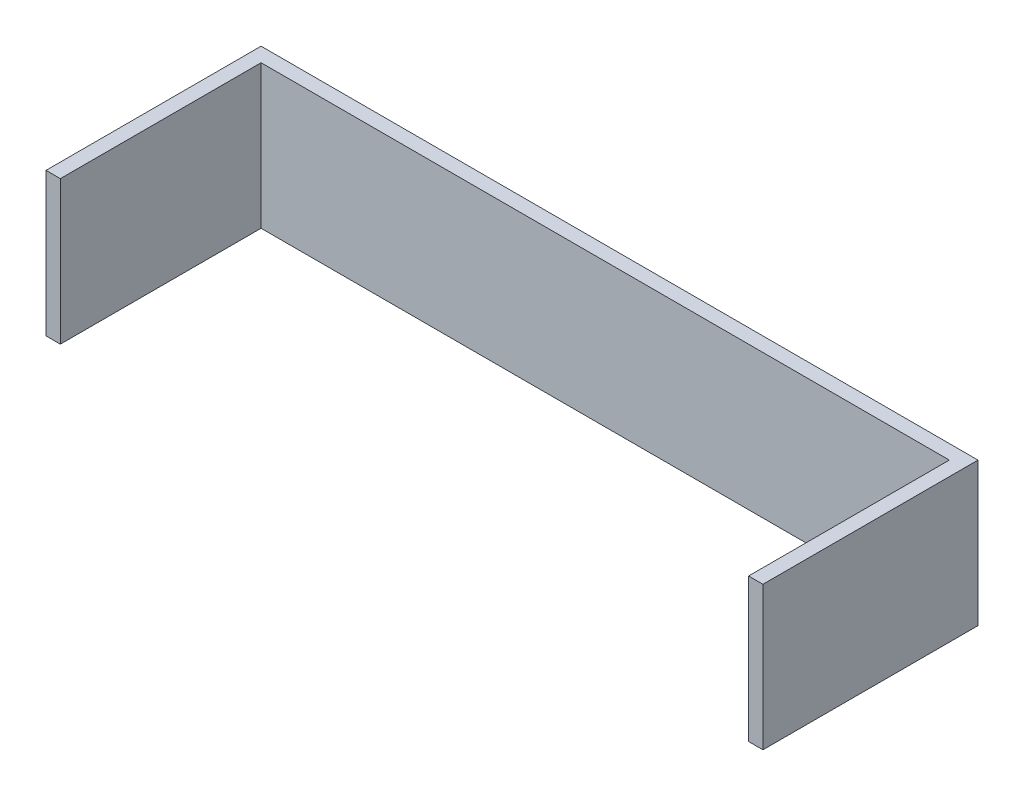
ISO-10303-21;
HEADER;
FILE_DESCRIPTION(('STEP AP214'),'2;1');
FILE_NAME('part.step','',(''),(''),'','','');
FILE_SCHEMA(('AUTOMOTIVE_DESIGN { 1 0 10303 214 1 1 1 1 }'));
ENDSEC;
DATA;
#1=APPLICATION_CONTEXT('core data for automotive mechanical design processes');
#2=APPLICATION_PROTOCOL_DEFINITION('international standard','automotive_design',2000,#1);
#3=PRODUCT_CONTEXT('',#1,'mechanical');
#4=PRODUCT('Part','Part','',(#3));
#5=PRODUCT_RELATED_PRODUCT_CATEGORY('part','',(#4));
#6=PRODUCT_DEFINITION_FORMATION('','',#4);
#7=PRODUCT_DEFINITION_CONTEXT('part definition',#1,'design');
#8=PRODUCT_DEFINITION('design','',#6,#7);
#9=PRODUCT_DEFINITION_SHAPE('','',#8);
#10=(LENGTH_UNIT() NAMED_UNIT(*) SI_UNIT(.MILLI.,.METRE.));
#11=(NAMED_UNIT(*) PLANE_ANGLE_UNIT() SI_UNIT($,.RADIAN.));
#12=(NAMED_UNIT(*) SI_UNIT($,.STERADIAN.) SOLID_ANGLE_UNIT());
#13=UNCERTAINTY_MEASURE_WITH_UNIT(LENGTH_MEASURE(1.E-05),#10,'distance_accuracy_value','');
#14=(GEOMETRIC_REPRESENTATION_CONTEXT(3) GLOBAL_UNCERTAINTY_ASSIGNED_CONTEXT((#13)) GLOBAL_UNIT_ASSIGNED_CONTEXT((#10,
#11,#12)) REPRESENTATION_CONTEXT('',''));
#15=CARTESIAN_POINT('',(0.,0.,0.));
#16=DIRECTION('',(0.,0.,1.));
#17=DIRECTION('',(1.,0.,0.));
#18=AXIS2_PLACEMENT_3D('',#15,#16,#17);
#19=CARTESIAN_POINT('',(24.,-5.,7.5));
#20=DIRECTION('',(0.,0.,1.));
#21=DIRECTION('',(1.,0.,0.));
#22=AXIS2_PLACEMENT_3D('',#19,#20,#21);
#23=PLANE('',#22);
#24=DIRECTION('',(1.,0.,0.));
#25=VECTOR('',#24,1.);
#26=CARTESIAN_POINT('',(24.,-5.,7.5));
#27=LINE('',#26,#25);
#28=CARTESIAN_POINT('',(24.,-5.,7.5));
#29=VERTEX_POINT('',#28);
#30=CARTESIAN_POINT('',(25.,-5.,7.5));
#31=VERTEX_POINT('',#30);
#32=EDGE_CURVE('E20',#29,#31,#27,.T.);
#33=ORIENTED_EDGE('',*,*,#32,.T.);
#34=DIRECTION('',(0.,1.,0.));
#35=VECTOR('',#34,1.);
#36=CARTESIAN_POINT('',(25.,-5.,7.5));
#37=LINE('',#36,#35);
#38=CARTESIAN_POINT('',(25.,5.,7.5));
#39=VERTEX_POINT('',#38);
#40=EDGE_CURVE('E118',#39,#31,#37,.F.);
#41=ORIENTED_EDGE('',*,*,#40,.F.);
#42=DIRECTION('',(1.,0.,0.));
#43=VECTOR('',#42,1.);
#44=CARTESIAN_POINT('',(0.,5.,7.5));
#45=LINE('',#44,#43);
#46=CARTESIAN_POINT('',(24.,5.,7.5));
#47=VERTEX_POINT('',#46);
#48=EDGE_CURVE('E144',#47,#39,#45,.T.);
#49=ORIENTED_EDGE('',*,*,#48,.F.);
#50=DIRECTION('',(0.,1.,0.));
#51=VECTOR('',#50,1.);
#52=CARTESIAN_POINT('',(24.,-5.,7.5));
#53=LINE('',#52,#51);
#54=EDGE_CURVE('E92',#29,#47,#53,.T.);
#55=ORIENTED_EDGE('',*,*,#54,.F.);
#56=EDGE_LOOP('',(#33,#41,#49,#55));
#57=FACE_BOUND('',#56,.T.);
#58=ADVANCED_FACE('F17',(#57),#23,.T.);
#59=CARTESIAN_POINT('',(-24.,-5.,7.5));
#60=DIRECTION('',(1.,0.,0.));
#61=DIRECTION('',(0.,0.,-1.));
#62=AXIS2_PLACEMENT_3D('',#59,#60,#61);
#63=PLANE('',#62);
#64=DIRECTION('',(0.,0.,1.));
#65=VECTOR('',#64,1.);
#66=CARTESIAN_POINT('',(-24.,-5.,0.));
#67=LINE('',#66,#65);
#68=CARTESIAN_POINT('',(-24.,-5.,7.5));
#69=VERTEX_POINT('',#68);
#70=CARTESIAN_POINT('',(-24.,-5.,-6.5));
#71=VERTEX_POINT('',#70);
#72=EDGE_CURVE('E140',#69,#71,#67,.F.);
#73=ORIENTED_EDGE('',*,*,#72,.T.);
#74=DIRECTION('',(0.,1.,0.));
#75=VECTOR('',#74,1.);
#76=CARTESIAN_POINT('',(-24.,-5.,-6.5));
#77=LINE('',#76,#75);
#78=CARTESIAN_POINT('',(-24.,5.,-6.5));
#79=VERTEX_POINT('',#78);
#80=EDGE_CURVE('E79',#79,#71,#77,.F.);
#81=ORIENTED_EDGE('',*,*,#80,.F.);
#82=DIRECTION('',(0.,0.,1.));
#83=VECTOR('',#82,1.);
#84=CARTESIAN_POINT('',(-24.,5.,0.));
#85=LINE('',#84,#83);
#86=CARTESIAN_POINT('',(-24.,5.,7.5));
#87=VERTEX_POINT('',#86);
#88=EDGE_CURVE('E95',#87,#79,#85,.F.);
#89=ORIENTED_EDGE('',*,*,#88,.F.);
#90=DIRECTION('',(0.,1.,0.));
#91=VECTOR('',#90,1.);
#92=CARTESIAN_POINT('',(-24.,-5.,7.5));
#93=LINE('',#92,#91);
#94=EDGE_CURVE('E84',#69,#87,#93,.T.);
#95=ORIENTED_EDGE('',*,*,#94,.F.);
#96=EDGE_LOOP('',(#73,#81,#89,#95));
#97=FACE_BOUND('',#96,.T.);
#98=ADVANCED_FACE('F96',(#97),#63,.T.);
#99=CARTESIAN_POINT('',(-24.,-5.,-6.5));
#100=DIRECTION('',(0.,0.,1.));
#101=DIRECTION('',(1.,0.,0.));
#102=AXIS2_PLACEMENT_3D('',#99,#100,#101);
#103=PLANE('',#102);
#104=DIRECTION('',(1.,0.,0.));
#105=VECTOR('',#104,1.);
#106=CARTESIAN_POINT('',(0.,-5.,-6.5));
#107=LINE('',#106,#105);
#108=CARTESIAN_POINT('',(24.,-5.,-6.5));
#109=VERTEX_POINT('',#108);
#110=EDGE_CURVE('E135',#71,#109,#107,.T.);
#111=ORIENTED_EDGE('',*,*,#110,.T.);
#112=DIRECTION('',(0.,1.,0.));
#113=VECTOR('',#112,1.);
#114=CARTESIAN_POINT('',(24.,-5.,-6.49999999999999));
#115=LINE('',#114,#113);
#116=CARTESIAN_POINT('',(24.,5.,-6.5));
#117=VERTEX_POINT('',#116);
#118=EDGE_CURVE('E109',#117,#109,#115,.F.);
#119=ORIENTED_EDGE('',*,*,#118,.F.);
#120=DIRECTION('',(1.,0.,0.));
#121=VECTOR('',#120,1.);
#122=CARTESIAN_POINT('',(0.,5.,-6.5));
#123=LINE('',#122,#121);
#124=EDGE_CURVE('E99',#79,#117,#123,.T.);
#125=ORIENTED_EDGE('',*,*,#124,.F.);
#126=ORIENTED_EDGE('',*,*,#80,.T.);
#127=EDGE_LOOP('',(#111,#119,#125,#126));
#128=FACE_BOUND('',#127,.T.);
#129=ADVANCED_FACE('F149',(#128),#103,.T.);
#130=CARTESIAN_POINT('',(24.,-5.,-6.49999999999999));
#131=DIRECTION('',(-1.,0.,0.));
#132=DIRECTION('',(0.,0.,1.));
#133=AXIS2_PLACEMENT_3D('',#130,#131,#132);
#134=PLANE('',#133);
#135=DIRECTION('',(0.,0.,1.));
#136=VECTOR('',#135,1.);
#137=CARTESIAN_POINT('',(24.,-5.,0.));
#138=LINE('',#137,#136);
#139=EDGE_CURVE('E132',#109,#29,#138,.T.);
#140=ORIENTED_EDGE('',*,*,#139,.T.);
#141=ORIENTED_EDGE('',*,*,#54,.T.);
#142=DIRECTION('',(0.,0.,1.));
#143=VECTOR('',#142,1.);
#144=CARTESIAN_POINT('',(24.,5.,0.));
#145=LINE('',#144,#143);
#146=EDGE_CURVE('E146',#117,#47,#145,.T.);
#147=ORIENTED_EDGE('',*,*,#146,.F.);
#148=ORIENTED_EDGE('',*,*,#118,.T.);
#149=EDGE_LOOP('',(#140,#141,#147,#148));
#150=FACE_BOUND('',#149,.T.);
#151=ADVANCED_FACE('F151',(#150),#134,.T.);
#152=CARTESIAN_POINT('',(-25.,-5.,7.5));
#153=DIRECTION('',(0.,0.,1.));
#154=DIRECTION('',(1.,0.,0.));
#155=AXIS2_PLACEMENT_3D('',#152,#153,#154);
#156=PLANE('',#155);
#157=DIRECTION('',(1.,0.,0.));
#158=VECTOR('',#157,1.);
#159=CARTESIAN_POINT('',(0.,-5.,7.5));
#160=LINE('',#159,#158);
#161=CARTESIAN_POINT('',(-25.,-5.,7.5));
#162=VERTEX_POINT('',#161);
#163=EDGE_CURVE('E90',#162,#69,#160,.T.);
#164=ORIENTED_EDGE('',*,*,#163,.T.);
#165=ORIENTED_EDGE('',*,*,#94,.T.);
#166=DIRECTION('',(1.,0.,0.));
#167=VECTOR('',#166,1.);
#168=CARTESIAN_POINT('',(0.,5.,7.5));
#169=LINE('',#168,#167);
#170=CARTESIAN_POINT('',(-25.,5.,7.5));
#171=VERTEX_POINT('',#170);
#172=EDGE_CURVE('E88',#171,#87,#169,.T.);
#173=ORIENTED_EDGE('',*,*,#172,.F.);
#174=DIRECTION('',(0.,1.,0.));
#175=VECTOR('',#174,1.);
#176=CARTESIAN_POINT('',(-25.,-5.,7.5));
#177=LINE('',#176,#175);
#178=EDGE_CURVE('E158',#162,#171,#177,.T.);
#179=ORIENTED_EDGE('',*,*,#178,.F.);
#180=EDGE_LOOP('',(#164,#165,#173,#179));
#181=FACE_BOUND('',#180,.T.);
#182=ADVANCED_FACE('F85',(#181),#156,.T.);
#183=CARTESIAN_POINT('',(0.,5.,0.));
#184=DIRECTION('',(0.,1.,0.));
#185=DIRECTION('',(0.,0.,1.));
#186=AXIS2_PLACEMENT_3D('',#183,#184,#185);
#187=PLANE('',#186);
#188=ORIENTED_EDGE('',*,*,#48,.T.);
#189=DIRECTION('',(0.,0.,-1.));
#190=VECTOR('',#189,1.);
#191=CARTESIAN_POINT('',(25.,5.,7.5));
#192=LINE('',#191,#190);
#193=CARTESIAN_POINT('',(25.,5.,-7.5));
#194=VERTEX_POINT('',#193);
#195=EDGE_CURVE('E127',#194,#39,#192,.F.);
#196=ORIENTED_EDGE('',*,*,#195,.F.);
#197=DIRECTION('',(-1.,0.,0.));
#198=VECTOR('',#197,1.);
#199=CARTESIAN_POINT('',(25.,5.,-7.5));
#200=LINE('',#199,#198);
#201=CARTESIAN_POINT('',(-25.,5.,-7.5));
#202=VERTEX_POINT('',#201);
#203=EDGE_CURVE('E153',#202,#194,#200,.F.);
#204=ORIENTED_EDGE('',*,*,#203,.F.);
#205=DIRECTION('',(0.,0.,1.));
#206=VECTOR('',#205,1.);
#207=CARTESIAN_POINT('',(-25.,5.,-7.5));
#208=LINE('',#207,#206);
#209=EDGE_CURVE('E103',#171,#202,#208,.F.);
#210=ORIENTED_EDGE('',*,*,#209,.F.);
#211=ORIENTED_EDGE('',*,*,#172,.T.);
#212=ORIENTED_EDGE('',*,*,#88,.T.);
#213=ORIENTED_EDGE('',*,*,#124,.T.);
#214=ORIENTED_EDGE('',*,*,#146,.T.);
#215=EDGE_LOOP('',(#188,#196,#204,#210,#211,#212,#213,#214));
#216=FACE_BOUND('',#215,.T.);
#217=ADVANCED_FACE('F101',(#216),#187,.T.);
#218=CARTESIAN_POINT('',(25.,-5.,7.5));
#219=DIRECTION('',(1.,0.,0.));
#220=DIRECTION('',(0.,0.,-1.));
#221=AXIS2_PLACEMENT_3D('',#218,#219,#220);
#222=PLANE('',#221);
#223=DIRECTION('',(0.,0.,1.));
#224=VECTOR('',#223,1.);
#225=CARTESIAN_POINT('',(25.,-5.,0.));
#226=LINE('',#225,#224);
#227=CARTESIAN_POINT('',(25.,-5.,-7.5));
#228=VERTEX_POINT('',#227);
#229=EDGE_CURVE('E126',#31,#228,#226,.F.);
#230=ORIENTED_EDGE('',*,*,#229,.T.);
#231=DIRECTION('',(0.,1.,0.));
#232=VECTOR('',#231,1.);
#233=CARTESIAN_POINT('',(25.,-5.,-7.5));
#234=LINE('',#233,#232);
#235=EDGE_CURVE('E154',#194,#228,#234,.F.);
#236=ORIENTED_EDGE('',*,*,#235,.F.);
#237=ORIENTED_EDGE('',*,*,#195,.T.);
#238=ORIENTED_EDGE('',*,*,#40,.T.);
#239=EDGE_LOOP('',(#230,#236,#237,#238));
#240=FACE_BOUND('',#239,.T.);
#241=ADVANCED_FACE('F124',(#240),#222,.T.);
#242=CARTESIAN_POINT('',(0.,-5.,0.));
#243=DIRECTION('',(0.,1.,0.));
#244=DIRECTION('',(0.,0.,1.));
#245=AXIS2_PLACEMENT_3D('',#242,#243,#244);
#246=PLANE('',#245);
#247=ORIENTED_EDGE('',*,*,#229,.F.);
#248=ORIENTED_EDGE('',*,*,#32,.F.);
#249=ORIENTED_EDGE('',*,*,#139,.F.);
#250=ORIENTED_EDGE('',*,*,#110,.F.);
#251=ORIENTED_EDGE('',*,*,#72,.F.);
#252=ORIENTED_EDGE('',*,*,#163,.F.);
#253=DIRECTION('',(0.,0.,1.));
#254=VECTOR('',#253,1.);
#255=CARTESIAN_POINT('',(-25.,-5.,-7.5));
#256=LINE('',#255,#254);
#257=CARTESIAN_POINT('',(-25.,-5.,-7.5));
#258=VERTEX_POINT('',#257);
#259=EDGE_CURVE('E35',#258,#162,#256,.T.);
#260=ORIENTED_EDGE('',*,*,#259,.F.);
#261=DIRECTION('',(-1.,0.,0.));
#262=VECTOR('',#261,1.);
#263=CARTESIAN_POINT('',(25.,-5.,-7.5));
#264=LINE('',#263,#262);
#265=EDGE_CURVE('E26',#228,#258,#264,.T.);
#266=ORIENTED_EDGE('',*,*,#265,.F.);
#267=EDGE_LOOP('',(#247,#248,#249,#250,#251,#252,#260,#266));
#268=FACE_BOUND('',#267,.T.);
#269=ADVANCED_FACE('F129',(#268),#246,.F.);
#270=CARTESIAN_POINT('',(-25.,-5.,-7.5));
#271=DIRECTION('',(-1.,0.,0.));
#272=DIRECTION('',(0.,0.,1.));
#273=AXIS2_PLACEMENT_3D('',#270,#271,#272);
#274=PLANE('',#273);
#275=ORIENTED_EDGE('',*,*,#259,.T.);
#276=ORIENTED_EDGE('',*,*,#178,.T.);
#277=ORIENTED_EDGE('',*,*,#209,.T.);
#278=DIRECTION('',(0.,1.,0.));
#279=VECTOR('',#278,1.);
#280=CARTESIAN_POINT('',(-25.,-5.,-7.5));
#281=LINE('',#280,#279);
#282=EDGE_CURVE('E11',#258,#202,#281,.T.);
#283=ORIENTED_EDGE('',*,*,#282,.F.);
#284=EDGE_LOOP('',(#275,#276,#277,#283));
#285=FACE_BOUND('',#284,.T.);
#286=ADVANCED_FACE('F163',(#285),#274,.T.);
#287=CARTESIAN_POINT('',(25.,-5.,-7.5));
#288=DIRECTION('',(0.,0.,-1.));
#289=DIRECTION('',(-1.,0.,0.));
#290=AXIS2_PLACEMENT_3D('',#287,#288,#289);
#291=PLANE('',#290);
#292=ORIENTED_EDGE('',*,*,#265,.T.);
#293=ORIENTED_EDGE('',*,*,#282,.T.);
#294=ORIENTED_EDGE('',*,*,#203,.T.);
#295=ORIENTED_EDGE('',*,*,#235,.T.);
#296=EDGE_LOOP('',(#292,#293,#294,#295));
#297=FACE_BOUND('',#296,.T.);
#298=ADVANCED_FACE('F157',(#297),#291,.T.);
#299=CLOSED_SHELL('',(#58,#98,#129,#151,#182,#217,#241,#269,#286,#298));
#300=MANIFOLD_SOLID_BREP('B1',#299);
#301=ADVANCED_BREP_SHAPE_REPRESENTATION('',(#18,#300),#14);
#302=SHAPE_DEFINITION_REPRESENTATION(#9,#301);
ENDSEC;
END-ISO-10303-21;
